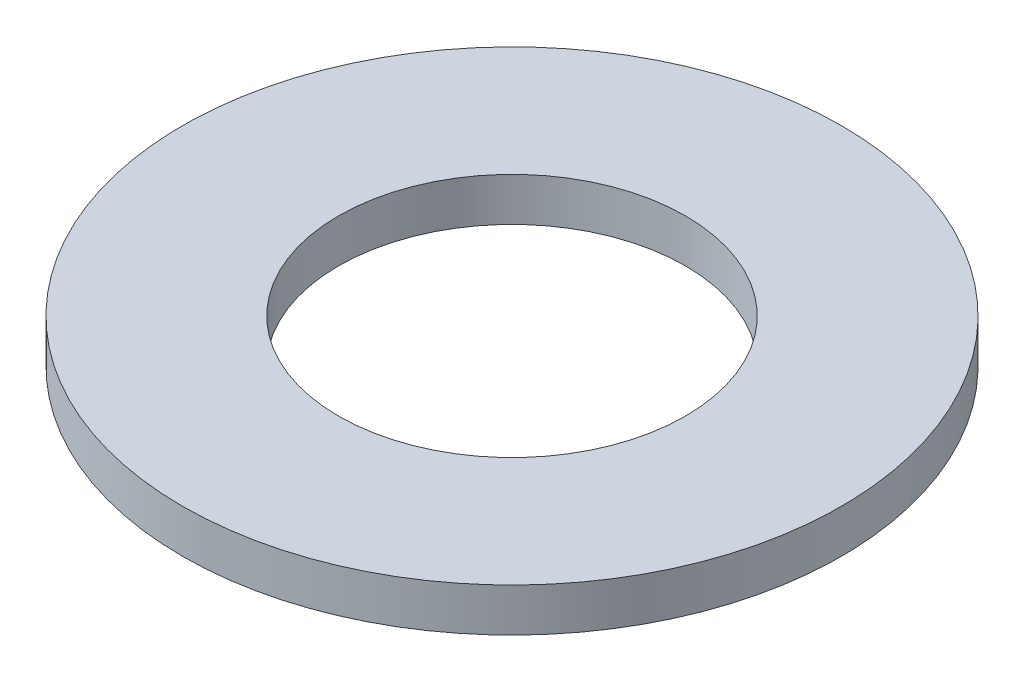
ISO-10303-21;
HEADER;
FILE_DESCRIPTION(('STEP AP214'),'2;1');
FILE_NAME('part.step','',(''),(''),'','','');
FILE_SCHEMA(('AUTOMOTIVE_DESIGN { 1 0 10303 214 1 1 1 1 }'));
ENDSEC;
DATA;
#1=APPLICATION_CONTEXT('core data for automotive mechanical design processes');
#2=APPLICATION_PROTOCOL_DEFINITION('international standard','automotive_design',2000,#1);
#3=PRODUCT_CONTEXT('',#1,'mechanical');
#4=PRODUCT('Part','Part','',(#3));
#5=PRODUCT_RELATED_PRODUCT_CATEGORY('part','',(#4));
#6=PRODUCT_DEFINITION_FORMATION('','',#4);
#7=PRODUCT_DEFINITION_CONTEXT('part definition',#1,'design');
#8=PRODUCT_DEFINITION('design','',#6,#7);
#9=PRODUCT_DEFINITION_SHAPE('','',#8);
#10=(LENGTH_UNIT() NAMED_UNIT(*) SI_UNIT(.MILLI.,.METRE.));
#11=(NAMED_UNIT(*) PLANE_ANGLE_UNIT() SI_UNIT($,.RADIAN.));
#12=(NAMED_UNIT(*) SI_UNIT($,.STERADIAN.) SOLID_ANGLE_UNIT());
#13=UNCERTAINTY_MEASURE_WITH_UNIT(LENGTH_MEASURE(1.E-05),#10,'distance_accuracy_value','');
#14=(GEOMETRIC_REPRESENTATION_CONTEXT(3) GLOBAL_UNCERTAINTY_ASSIGNED_CONTEXT((#13)) GLOBAL_UNIT_ASSIGNED_CONTEXT((#10,
#11,#12)) REPRESENTATION_CONTEXT('',''));
#15=CARTESIAN_POINT('',(0.,0.,0.));
#16=DIRECTION('',(0.,0.,1.));
#17=DIRECTION('',(1.,0.,0.));
#18=AXIS2_PLACEMENT_3D('',#15,#16,#17);
#19=CARTESIAN_POINT('',(0.,5.,0.));
#20=DIRECTION('',(0.,1.,0.));
#21=DIRECTION('',(0.,0.,1.));
#22=AXIS2_PLACEMENT_3D('',#19,#20,#21);
#23=PLANE('',#22);
#24=CARTESIAN_POINT('',(0.,5.,0.));
#25=DIRECTION('',(0.,1.,0.));
#26=DIRECTION('',(0.,0.,1.));
#27=AXIS2_PLACEMENT_3D('',#24,#25,#26);
#28=CIRCLE('',#27,38.);
#29=CARTESIAN_POINT('',(0.,5.,38.));
#30=VERTEX_POINT('',#29);
#31=EDGE_CURVE('E10',#30,#30,#28,.T.);
#32=ORIENTED_EDGE('',*,*,#31,.T.);
#33=EDGE_LOOP('',(#32));
#34=FACE_BOUND('',#33,.T.);
#35=CARTESIAN_POINT('',(0.,5.,0.));
#36=DIRECTION('',(0.,1.,0.));
#37=DIRECTION('',(0.,0.,1.));
#38=AXIS2_PLACEMENT_3D('',#35,#36,#37);
#39=CIRCLE('',#38,20.);
#40=CARTESIAN_POINT('',(0.,5.,20.));
#41=VERTEX_POINT('',#40);
#42=EDGE_CURVE('E48',#41,#41,#39,.T.);
#43=ORIENTED_EDGE('',*,*,#42,.F.);
#44=EDGE_LOOP('',(#43));
#45=FACE_BOUND('',#44,.T.);
#46=ADVANCED_FACE('F37',(#34,#45),#23,.T.);
#47=CARTESIAN_POINT('',(0.,0.,0.));
#48=DIRECTION('',(0.,1.,0.));
#49=DIRECTION('',(0.,0.,1.));
#50=AXIS2_PLACEMENT_3D('',#47,#48,#49);
#51=PLANE('',#50);
#52=CARTESIAN_POINT('',(0.,0.,0.));
#53=DIRECTION('',(0.,1.,0.));
#54=DIRECTION('',(0.,0.,1.));
#55=AXIS2_PLACEMENT_3D('',#52,#53,#54);
#56=CIRCLE('',#55,38.);
#57=CARTESIAN_POINT('',(0.,0.,38.));
#58=VERTEX_POINT('',#57);
#59=EDGE_CURVE('E41',#58,#58,#56,.T.);
#60=ORIENTED_EDGE('',*,*,#59,.F.);
#61=EDGE_LOOP('',(#60));
#62=FACE_BOUND('',#61,.T.);
#63=CARTESIAN_POINT('',(0.,0.,0.));
#64=DIRECTION('',(0.,1.,0.));
#65=DIRECTION('',(0.,0.,1.));
#66=AXIS2_PLACEMENT_3D('',#63,#64,#65);
#67=CIRCLE('',#66,20.);
#68=CARTESIAN_POINT('',(0.,0.,20.));
#69=VERTEX_POINT('',#68);
#70=EDGE_CURVE('E50',#69,#69,#67,.T.);
#71=ORIENTED_EDGE('',*,*,#70,.T.);
#72=EDGE_LOOP('',(#71));
#73=FACE_BOUND('',#72,.T.);
#74=ADVANCED_FACE('F60',(#62,#73),#51,.F.);
#75=CARTESIAN_POINT('',(0.,5.,0.));
#76=DIRECTION('',(0.,-1.,0.));
#77=DIRECTION('',(0.,0.,-1.));
#78=AXIS2_PLACEMENT_3D('',#75,#76,#77);
#79=CYLINDRICAL_SURFACE('',#78,38.);
#80=ORIENTED_EDGE('',*,*,#31,.F.);
#81=EDGE_LOOP('',(#80));
#82=FACE_BOUND('',#81,.T.);
#83=ORIENTED_EDGE('',*,*,#59,.T.);
#84=EDGE_LOOP('',(#83));
#85=FACE_BOUND('',#84,.T.);
#86=ADVANCED_FACE('F39',(#82,#85),#79,.T.);
#87=CARTESIAN_POINT('',(0.,5.,0.));
#88=DIRECTION('',(0.,-1.,0.));
#89=DIRECTION('',(0.,0.,-1.));
#90=AXIS2_PLACEMENT_3D('',#87,#88,#89);
#91=CYLINDRICAL_SURFACE('',#90,20.);
#92=ORIENTED_EDGE('',*,*,#42,.T.);
#93=EDGE_LOOP('',(#92));
#94=FACE_BOUND('',#93,.T.);
#95=ORIENTED_EDGE('',*,*,#70,.F.);
#96=EDGE_LOOP('',(#95));
#97=FACE_BOUND('',#96,.T.);
#98=ADVANCED_FACE('F56',(#94,#97),#91,.F.);
#99=CLOSED_SHELL('',(#46,#74,#86,#98));
#100=MANIFOLD_SOLID_BREP('B2',#99);
#101=ADVANCED_BREP_SHAPE_REPRESENTATION('',(#18,#100),#14);
#102=SHAPE_DEFINITION_REPRESENTATION(#9,#101);
ENDSEC;
END-ISO-10303-21;
